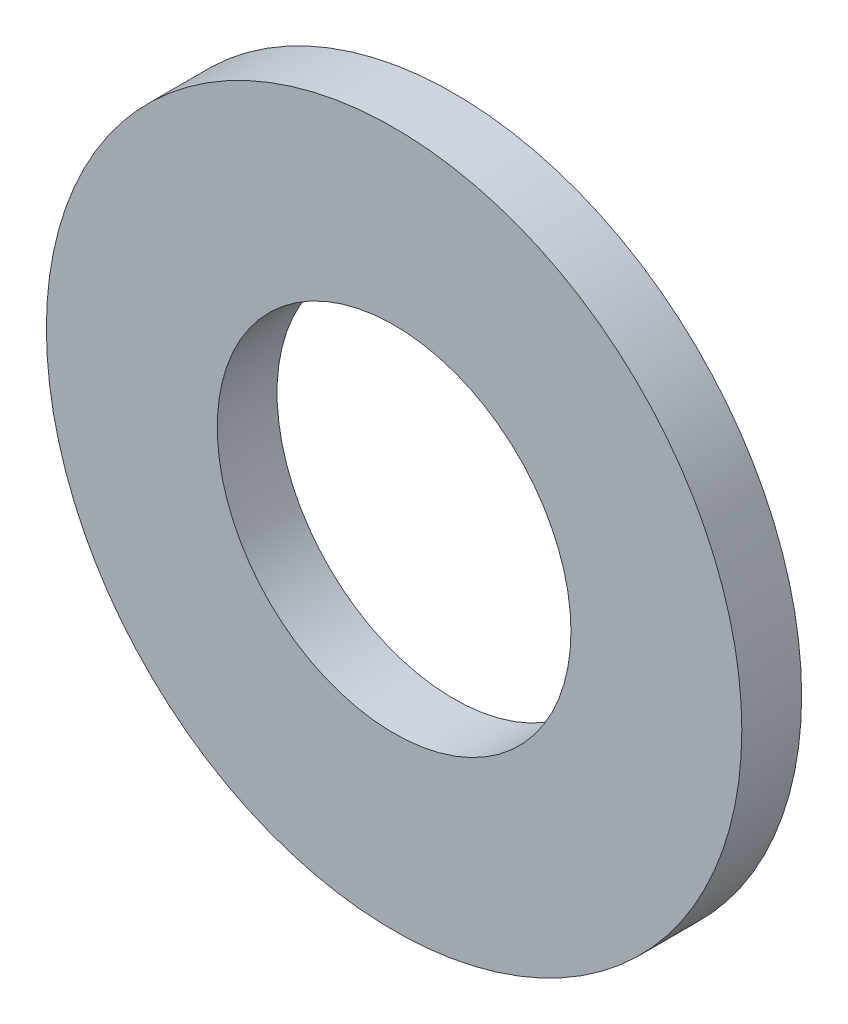
ISO-10303-21;
HEADER;
FILE_DESCRIPTION(('STEP AP214'),'2;1');
FILE_NAME('part.step','',(''),(''),'','','');
FILE_SCHEMA(('AUTOMOTIVE_DESIGN { 1 0 10303 214 1 1 1 1 }'));
ENDSEC;
DATA;
#1=APPLICATION_CONTEXT('core data for automotive mechanical design processes');
#2=APPLICATION_PROTOCOL_DEFINITION('international standard','automotive_design',2000,#1);
#3=PRODUCT_CONTEXT('',#1,'mechanical');
#4=PRODUCT('Part','Part','',(#3));
#5=PRODUCT_RELATED_PRODUCT_CATEGORY('part','',(#4));
#6=PRODUCT_DEFINITION_FORMATION('','',#4);
#7=PRODUCT_DEFINITION_CONTEXT('part definition',#1,'design');
#8=PRODUCT_DEFINITION('design','',#6,#7);
#9=PRODUCT_DEFINITION_SHAPE('','',#8);
#10=(LENGTH_UNIT() NAMED_UNIT(*) SI_UNIT(.MILLI.,.METRE.));
#11=(NAMED_UNIT(*) PLANE_ANGLE_UNIT() SI_UNIT($,.RADIAN.));
#12=(NAMED_UNIT(*) SI_UNIT($,.STERADIAN.) SOLID_ANGLE_UNIT());
#13=UNCERTAINTY_MEASURE_WITH_UNIT(LENGTH_MEASURE(1.E-05),#10,'distance_accuracy_value','');
#14=(GEOMETRIC_REPRESENTATION_CONTEXT(3) GLOBAL_UNCERTAINTY_ASSIGNED_CONTEXT((#13)) GLOBAL_UNIT_ASSIGNED_CONTEXT((#10,
#11,#12)) REPRESENTATION_CONTEXT('',''));
#15=CARTESIAN_POINT('',(0.,0.,0.));
#16=DIRECTION('',(0.,0.,1.));
#17=DIRECTION('',(1.,0.,0.));
#18=AXIS2_PLACEMENT_3D('',#15,#16,#17);
#19=CARTESIAN_POINT('',(0.,0.,3.5));
#20=DIRECTION('',(0.,0.,1.));
#21=DIRECTION('',(1.,0.,0.));
#22=AXIS2_PLACEMENT_3D('',#19,#20,#21);
#23=PLANE('',#22);
#24=CARTESIAN_POINT('',(0.,0.,3.5));
#25=DIRECTION('',(0.,0.,1.));
#26=DIRECTION('',(1.,0.,0.));
#27=AXIS2_PLACEMENT_3D('',#24,#25,#26);
#28=CIRCLE('',#27,20.35);
#29=CARTESIAN_POINT('',(20.35,0.,3.5));
#30=VERTEX_POINT('',#29);
#31=EDGE_CURVE('E10',#30,#30,#28,.T.);
#32=ORIENTED_EDGE('',*,*,#31,.T.);
#33=EDGE_LOOP('',(#32));
#34=FACE_BOUND('',#33,.T.);
#35=CARTESIAN_POINT('',(0.,0.,3.5));
#36=DIRECTION('',(0.,0.,1.));
#37=DIRECTION('',(1.,0.,0.));
#38=AXIS2_PLACEMENT_3D('',#35,#36,#37);
#39=CIRCLE('',#38,10.35);
#40=CARTESIAN_POINT('',(10.35,0.,3.5));
#41=VERTEX_POINT('',#40);
#42=EDGE_CURVE('E44',#41,#41,#39,.T.);
#43=ORIENTED_EDGE('',*,*,#42,.F.);
#44=EDGE_LOOP('',(#43));
#45=FACE_BOUND('',#44,.T.);
#46=ADVANCED_FACE('F33',(#34,#45),#23,.T.);
#47=CARTESIAN_POINT('',(0.,0.,0.));
#48=DIRECTION('',(0.,0.,1.));
#49=DIRECTION('',(1.,0.,0.));
#50=AXIS2_PLACEMENT_3D('',#47,#48,#49);
#51=PLANE('',#50);
#52=CARTESIAN_POINT('',(0.,0.,0.));
#53=DIRECTION('',(0.,0.,1.));
#54=DIRECTION('',(1.,0.,0.));
#55=AXIS2_PLACEMENT_3D('',#52,#53,#54);
#56=CIRCLE('',#55,20.35);
#57=CARTESIAN_POINT('',(20.35,0.,0.));
#58=VERTEX_POINT('',#57);
#59=EDGE_CURVE('E37',#58,#58,#56,.T.);
#60=ORIENTED_EDGE('',*,*,#59,.F.);
#61=EDGE_LOOP('',(#60));
#62=FACE_BOUND('',#61,.T.);
#63=CARTESIAN_POINT('',(0.,0.,0.));
#64=DIRECTION('',(0.,0.,1.));
#65=DIRECTION('',(1.,0.,0.));
#66=AXIS2_PLACEMENT_3D('',#63,#64,#65);
#67=CIRCLE('',#66,10.35);
#68=CARTESIAN_POINT('',(10.35,0.,0.));
#69=VERTEX_POINT('',#68);
#70=EDGE_CURVE('E46',#69,#69,#67,.T.);
#71=ORIENTED_EDGE('',*,*,#70,.T.);
#72=EDGE_LOOP('',(#71));
#73=FACE_BOUND('',#72,.T.);
#74=ADVANCED_FACE('F56',(#62,#73),#51,.F.);
#75=CARTESIAN_POINT('',(0.,0.,3.5));
#76=DIRECTION('',(0.,0.,-1.));
#77=DIRECTION('',(-1.,0.,0.));
#78=AXIS2_PLACEMENT_3D('',#75,#76,#77);
#79=CYLINDRICAL_SURFACE('',#78,20.35);
#80=ORIENTED_EDGE('',*,*,#31,.F.);
#81=EDGE_LOOP('',(#80));
#82=FACE_BOUND('',#81,.T.);
#83=ORIENTED_EDGE('',*,*,#59,.T.);
#84=EDGE_LOOP('',(#83));
#85=FACE_BOUND('',#84,.T.);
#86=ADVANCED_FACE('F35',(#82,#85),#79,.T.);
#87=CARTESIAN_POINT('',(0.,0.,3.5));
#88=DIRECTION('',(0.,0.,-1.));
#89=DIRECTION('',(-1.,0.,0.));
#90=AXIS2_PLACEMENT_3D('',#87,#88,#89);
#91=CYLINDRICAL_SURFACE('',#90,10.35);
#92=ORIENTED_EDGE('',*,*,#42,.T.);
#93=EDGE_LOOP('',(#92));
#94=FACE_BOUND('',#93,.T.);
#95=ORIENTED_EDGE('',*,*,#70,.F.);
#96=EDGE_LOOP('',(#95));
#97=FACE_BOUND('',#96,.T.);
#98=ADVANCED_FACE('F52',(#94,#97),#91,.F.);
#99=CLOSED_SHELL('',(#46,#74,#86,#98));
#100=MANIFOLD_SOLID_BREP('B2',#99);
#101=ADVANCED_BREP_SHAPE_REPRESENTATION('',(#18,#100),#14);
#102=SHAPE_DEFINITION_REPRESENTATION(#9,#101);
ENDSEC;
END-ISO-10303-21;
